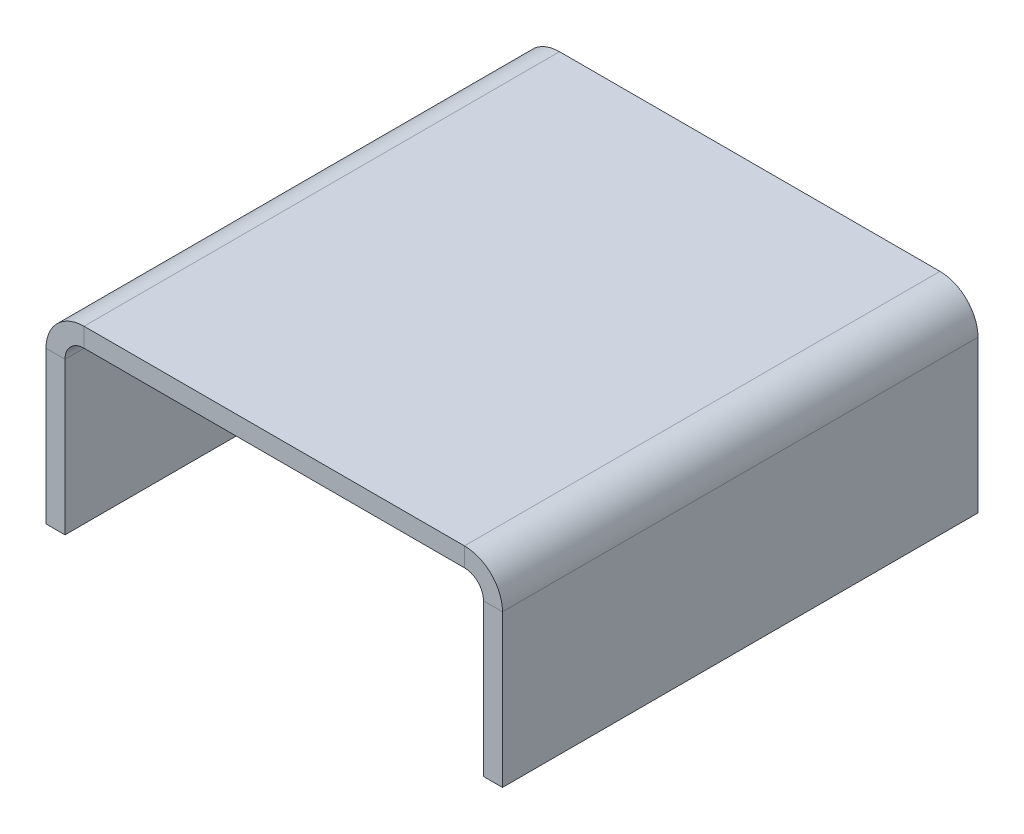
ISO-10303-21;
HEADER;
FILE_DESCRIPTION(('STEP AP214'),'2;1');
FILE_NAME('part.step','',(''),(''),'','','');
FILE_SCHEMA(('AUTOMOTIVE_DESIGN { 1 0 10303 214 1 1 1 1 }'));
ENDSEC;
DATA;
#1=APPLICATION_CONTEXT('core data for automotive mechanical design processes');
#2=APPLICATION_PROTOCOL_DEFINITION('international standard','automotive_design',2000,#1);
#3=PRODUCT_CONTEXT('',#1,'mechanical');
#4=PRODUCT('Part','Part','',(#3));
#5=PRODUCT_RELATED_PRODUCT_CATEGORY('part','',(#4));
#6=PRODUCT_DEFINITION_FORMATION('','',#4);
#7=PRODUCT_DEFINITION_CONTEXT('part definition',#1,'design');
#8=PRODUCT_DEFINITION('design','',#6,#7);
#9=PRODUCT_DEFINITION_SHAPE('','',#8);
#10=(LENGTH_UNIT() NAMED_UNIT(*) SI_UNIT(.MILLI.,.METRE.));
#11=(NAMED_UNIT(*) PLANE_ANGLE_UNIT() SI_UNIT($,.RADIAN.));
#12=(NAMED_UNIT(*) SI_UNIT($,.STERADIAN.) SOLID_ANGLE_UNIT());
#13=UNCERTAINTY_MEASURE_WITH_UNIT(LENGTH_MEASURE(1.E-05),#10,'distance_accuracy_value','');
#14=(GEOMETRIC_REPRESENTATION_CONTEXT(3) GLOBAL_UNCERTAINTY_ASSIGNED_CONTEXT((#13)) GLOBAL_UNIT_ASSIGNED_CONTEXT((#10,
#11,#12)) REPRESENTATION_CONTEXT('',''));
#15=CARTESIAN_POINT('',(0.,0.,0.));
#16=DIRECTION('',(0.,0.,1.));
#17=DIRECTION('',(1.,0.,0.));
#18=AXIS2_PLACEMENT_3D('',#15,#16,#17);
#19=CARTESIAN_POINT('',(0.,16.,-50.));
#20=DIRECTION('',(0.,0.,-1.));
#21=DIRECTION('',(-1.,0.,0.));
#22=AXIS2_PLACEMENT_3D('',#19,#20,#21);
#23=PLANE('',#22);
#24=DIRECTION('',(1.,0.,0.));
#25=VECTOR('',#24,1.);
#26=CARTESIAN_POINT('',(0.,16.,-50.));
#27=LINE('',#26,#25);
#28=CARTESIAN_POINT('',(0.,16.,-50.));
#29=VERTEX_POINT('',#28);
#30=CARTESIAN_POINT('',(2.,16.,-50.));
#31=VERTEX_POINT('',#30);
#32=EDGE_CURVE('E11',#29,#31,#27,.T.);
#33=ORIENTED_EDGE('',*,*,#32,.F.);
#34=CARTESIAN_POINT('',(4.,16.,-50.));
#35=DIRECTION('',(0.,0.,1.));
#36=DIRECTION('',(1.,0.,0.));
#37=AXIS2_PLACEMENT_3D('',#34,#35,#36);
#38=CIRCLE('',#37,4.);
#39=CARTESIAN_POINT('',(4.,20.,-50.));
#40=VERTEX_POINT('',#39);
#41=EDGE_CURVE('E173',#29,#40,#38,.F.);
#42=ORIENTED_EDGE('',*,*,#41,.T.);
#43=DIRECTION('',(0.,1.,0.));
#44=VECTOR('',#43,1.);
#45=CARTESIAN_POINT('',(4.,18.,-50.));
#46=LINE('',#45,#44);
#47=CARTESIAN_POINT('',(4.,18.,-50.));
#48=VERTEX_POINT('',#47);
#49=EDGE_CURVE('E53',#48,#40,#46,.T.);
#50=ORIENTED_EDGE('',*,*,#49,.F.);
#51=CARTESIAN_POINT('',(4.,16.,-50.));
#52=DIRECTION('',(0.,0.,1.));
#53=DIRECTION('',(1.,0.,0.));
#54=AXIS2_PLACEMENT_3D('',#51,#52,#53);
#55=CIRCLE('',#54,2.);
#56=EDGE_CURVE('E170',#31,#48,#55,.F.);
#57=ORIENTED_EDGE('',*,*,#56,.F.);
#58=EDGE_LOOP('',(#33,#42,#50,#57));
#59=FACE_BOUND('',#58,.T.);
#60=ADVANCED_FACE('F44',(#59),#23,.T.);
#61=CARTESIAN_POINT('',(4.,18.,-50.));
#62=DIRECTION('',(0.,0.,-1.));
#63=DIRECTION('',(-1.,0.,0.));
#64=AXIS2_PLACEMENT_3D('',#61,#62,#63);
#65=PLANE('',#64);
#66=DIRECTION('',(0.,1.,0.));
#67=VECTOR('',#66,1.);
#68=CARTESIAN_POINT('',(0.,0.,-50.));
#69=LINE('',#68,#67);
#70=CARTESIAN_POINT('',(0.,0.,-50.));
#71=VERTEX_POINT('',#70);
#72=EDGE_CURVE('E329',#71,#29,#69,.T.);
#73=ORIENTED_EDGE('',*,*,#72,.T.);
#74=ORIENTED_EDGE('',*,*,#32,.T.);
#75=DIRECTION('',(0.,1.,0.));
#76=VECTOR('',#75,1.);
#77=CARTESIAN_POINT('',(2.,0.,-50.));
#78=LINE('',#77,#76);
#79=CARTESIAN_POINT('',(2.,0.,-50.));
#80=VERTEX_POINT('',#79);
#81=EDGE_CURVE('E206',#80,#31,#78,.T.);
#82=ORIENTED_EDGE('',*,*,#81,.F.);
#83=DIRECTION('',(-1.,0.,0.));
#84=VECTOR('',#83,1.);
#85=CARTESIAN_POINT('',(2.,0.,-50.));
#86=LINE('',#85,#84);
#87=EDGE_CURVE('E209',#80,#71,#86,.T.);
#88=ORIENTED_EDGE('',*,*,#87,.T.);
#89=EDGE_LOOP('',(#73,#74,#82,#88));
#90=FACE_BOUND('',#89,.T.);
#91=ADVANCED_FACE('F341',(#90),#65,.T.);
#92=CARTESIAN_POINT('',(4.,20.,0.));
#93=DIRECTION('',(0.,0.,1.));
#94=DIRECTION('',(1.,0.,0.));
#95=AXIS2_PLACEMENT_3D('',#92,#93,#94);
#96=PLANE('',#95);
#97=DIRECTION('',(0.,-1.,0.));
#98=VECTOR('',#97,1.);
#99=CARTESIAN_POINT('',(4.,20.,0.));
#100=LINE('',#99,#98);
#101=CARTESIAN_POINT('',(4.,20.,0.));
#102=VERTEX_POINT('',#101);
#103=CARTESIAN_POINT('',(4.,18.,0.));
#104=VERTEX_POINT('',#103);
#105=EDGE_CURVE('E179',#102,#104,#100,.T.);
#106=ORIENTED_EDGE('',*,*,#105,.F.);
#107=CARTESIAN_POINT('',(4.,16.,0.));
#108=DIRECTION('',(0.,0.,1.));
#109=DIRECTION('',(1.,0.,0.));
#110=AXIS2_PLACEMENT_3D('',#107,#108,#109);
#111=CIRCLE('',#110,4.);
#112=CARTESIAN_POINT('',(0.,16.,0.));
#113=VERTEX_POINT('',#112);
#114=EDGE_CURVE('E235',#113,#102,#111,.F.);
#115=ORIENTED_EDGE('',*,*,#114,.F.);
#116=DIRECTION('',(-1.,0.,0.));
#117=VECTOR('',#116,1.);
#118=CARTESIAN_POINT('',(2.,16.,0.));
#119=LINE('',#118,#117);
#120=CARTESIAN_POINT('',(2.,16.,0.));
#121=VERTEX_POINT('',#120);
#122=EDGE_CURVE('E303',#121,#113,#119,.T.);
#123=ORIENTED_EDGE('',*,*,#122,.F.);
#124=CARTESIAN_POINT('',(4.,16.,0.));
#125=DIRECTION('',(0.,0.,1.));
#126=DIRECTION('',(1.,0.,0.));
#127=AXIS2_PLACEMENT_3D('',#124,#125,#126);
#128=CIRCLE('',#127,2.);
#129=EDGE_CURVE('E250',#121,#104,#128,.F.);
#130=ORIENTED_EDGE('',*,*,#129,.T.);
#131=EDGE_LOOP('',(#106,#115,#123,#130));
#132=FACE_BOUND('',#131,.T.);
#133=ADVANCED_FACE('F313',(#132),#96,.T.);
#134=CARTESIAN_POINT('',(2.,16.,0.));
#135=DIRECTION('',(0.,0.,1.));
#136=DIRECTION('',(1.,0.,0.));
#137=AXIS2_PLACEMENT_3D('',#134,#135,#136);
#138=PLANE('',#137);
#139=DIRECTION('',(1.,0.,0.));
#140=VECTOR('',#139,1.);
#141=CARTESIAN_POINT('',(0.,20.,0.));
#142=LINE('',#141,#140);
#143=CARTESIAN_POINT('',(44.,20.,0.));
#144=VERTEX_POINT('',#143);
#145=EDGE_CURVE('E231',#102,#144,#142,.T.);
#146=ORIENTED_EDGE('',*,*,#145,.F.);
#147=ORIENTED_EDGE('',*,*,#105,.T.);
#148=DIRECTION('',(1.,0.,0.));
#149=VECTOR('',#148,1.);
#150=CARTESIAN_POINT('',(0.,18.,0.));
#151=LINE('',#150,#149);
#152=CARTESIAN_POINT('',(44.,18.,0.));
#153=VERTEX_POINT('',#152);
#154=EDGE_CURVE('E188',#104,#153,#151,.T.);
#155=ORIENTED_EDGE('',*,*,#154,.T.);
#156=DIRECTION('',(0.,1.,0.));
#157=VECTOR('',#156,1.);
#158=CARTESIAN_POINT('',(44.,18.,0.));
#159=LINE('',#158,#157);
#160=EDGE_CURVE('E117',#153,#144,#159,.T.);
#161=ORIENTED_EDGE('',*,*,#160,.T.);
#162=EDGE_LOOP('',(#146,#147,#155,#161));
#163=FACE_BOUND('',#162,.T.);
#164=ADVANCED_FACE('F309',(#163),#138,.T.);
#165=CARTESIAN_POINT('',(44.,20.,-50.));
#166=DIRECTION('',(0.,0.,-1.));
#167=DIRECTION('',(-1.,0.,0.));
#168=AXIS2_PLACEMENT_3D('',#165,#166,#167);
#169=PLANE('',#168);
#170=DIRECTION('',(0.,-1.,0.));
#171=VECTOR('',#170,1.);
#172=CARTESIAN_POINT('',(44.,20.,-50.));
#173=LINE('',#172,#171);
#174=CARTESIAN_POINT('',(44.,20.,-50.));
#175=VERTEX_POINT('',#174);
#176=CARTESIAN_POINT('',(44.,18.,-50.));
#177=VERTEX_POINT('',#176);
#178=EDGE_CURVE('E197',#175,#177,#173,.T.);
#179=ORIENTED_EDGE('',*,*,#178,.F.);
#180=CARTESIAN_POINT('',(44.,16.,-50.));
#181=DIRECTION('',(0.,0.,1.));
#182=DIRECTION('',(1.,0.,0.));
#183=AXIS2_PLACEMENT_3D('',#180,#181,#182);
#184=CIRCLE('',#183,4.);
#185=CARTESIAN_POINT('',(48.,16.,-50.));
#186=VERTEX_POINT('',#185);
#187=EDGE_CURVE('E324',#175,#186,#184,.F.);
#188=ORIENTED_EDGE('',*,*,#187,.T.);
#189=DIRECTION('',(1.,0.,0.));
#190=VECTOR('',#189,1.);
#191=CARTESIAN_POINT('',(46.,16.,-50.));
#192=LINE('',#191,#190);
#193=CARTESIAN_POINT('',(46.,16.,-50.));
#194=VERTEX_POINT('',#193);
#195=EDGE_CURVE('E64',#194,#186,#192,.T.);
#196=ORIENTED_EDGE('',*,*,#195,.F.);
#197=CARTESIAN_POINT('',(44.,16.,-50.));
#198=DIRECTION('',(0.,0.,1.));
#199=DIRECTION('',(1.,0.,0.));
#200=AXIS2_PLACEMENT_3D('',#197,#198,#199);
#201=CIRCLE('',#200,2.);
#202=EDGE_CURVE('E200',#177,#194,#201,.F.);
#203=ORIENTED_EDGE('',*,*,#202,.F.);
#204=EDGE_LOOP('',(#179,#188,#196,#203));
#205=FACE_BOUND('',#204,.T.);
#206=ADVANCED_FACE('F373',(#205),#169,.T.);
#207=CARTESIAN_POINT('',(46.,16.,-50.));
#208=DIRECTION('',(0.,0.,-1.));
#209=DIRECTION('',(-1.,0.,0.));
#210=AXIS2_PLACEMENT_3D('',#207,#208,#209);
#211=PLANE('',#210);
#212=DIRECTION('',(1.,0.,0.));
#213=VECTOR('',#212,1.);
#214=CARTESIAN_POINT('',(0.,20.,-50.));
#215=LINE('',#214,#213);
#216=EDGE_CURVE('E321',#40,#175,#215,.T.);
#217=ORIENTED_EDGE('',*,*,#216,.T.);
#218=ORIENTED_EDGE('',*,*,#178,.T.);
#219=DIRECTION('',(1.,0.,0.));
#220=VECTOR('',#219,1.);
#221=CARTESIAN_POINT('',(0.,18.,-50.));
#222=LINE('',#221,#220);
#223=EDGE_CURVE('E186',#48,#177,#222,.T.);
#224=ORIENTED_EDGE('',*,*,#223,.F.);
#225=ORIENTED_EDGE('',*,*,#49,.T.);
#226=EDGE_LOOP('',(#217,#218,#224,#225));
#227=FACE_BOUND('',#226,.T.);
#228=ADVANCED_FACE('F196',(#227),#211,.T.);
#229=CARTESIAN_POINT('',(48.,16.,0.));
#230=DIRECTION('',(0.,0.,1.));
#231=DIRECTION('',(1.,0.,0.));
#232=AXIS2_PLACEMENT_3D('',#229,#230,#231);
#233=PLANE('',#232);
#234=DIRECTION('',(-1.,0.,0.));
#235=VECTOR('',#234,1.);
#236=CARTESIAN_POINT('',(48.,16.,0.));
#237=LINE('',#236,#235);
#238=CARTESIAN_POINT('',(48.,16.,0.));
#239=VERTEX_POINT('',#238);
#240=CARTESIAN_POINT('',(46.,16.,0.));
#241=VERTEX_POINT('',#240);
#242=EDGE_CURVE('E124',#239,#241,#237,.T.);
#243=ORIENTED_EDGE('',*,*,#242,.F.);
#244=CARTESIAN_POINT('',(44.,16.,0.));
#245=DIRECTION('',(0.,0.,1.));
#246=DIRECTION('',(1.,0.,0.));
#247=AXIS2_PLACEMENT_3D('',#244,#245,#246);
#248=CIRCLE('',#247,4.);
#249=EDGE_CURVE('E227',#144,#239,#248,.F.);
#250=ORIENTED_EDGE('',*,*,#249,.F.);
#251=ORIENTED_EDGE('',*,*,#160,.F.);
#252=CARTESIAN_POINT('',(44.,16.,0.));
#253=DIRECTION('',(0.,0.,1.));
#254=DIRECTION('',(1.,0.,0.));
#255=AXIS2_PLACEMENT_3D('',#252,#253,#254);
#256=CIRCLE('',#255,2.);
#257=EDGE_CURVE('E255',#153,#241,#256,.F.);
#258=ORIENTED_EDGE('',*,*,#257,.T.);
#259=EDGE_LOOP('',(#243,#250,#251,#258));
#260=FACE_BOUND('',#259,.T.);
#261=ADVANCED_FACE('F378',(#260),#233,.T.);
#262=CARTESIAN_POINT('',(44.,18.,0.));
#263=DIRECTION('',(0.,0.,1.));
#264=DIRECTION('',(1.,0.,0.));
#265=AXIS2_PLACEMENT_3D('',#262,#263,#264);
#266=PLANE('',#265);
#267=DIRECTION('',(0.,-1.,0.));
#268=VECTOR('',#267,1.);
#269=CARTESIAN_POINT('',(48.,20.,0.));
#270=LINE('',#269,#268);
#271=CARTESIAN_POINT('',(48.,0.,0.));
#272=VERTEX_POINT('',#271);
#273=EDGE_CURVE('E224',#239,#272,#270,.T.);
#274=ORIENTED_EDGE('',*,*,#273,.F.);
#275=ORIENTED_EDGE('',*,*,#242,.T.);
#276=DIRECTION('',(0.,1.,0.));
#277=VECTOR('',#276,1.);
#278=CARTESIAN_POINT('',(46.,20.,0.));
#279=LINE('',#278,#277);
#280=CARTESIAN_POINT('',(46.,0.,0.));
#281=VERTEX_POINT('',#280);
#282=EDGE_CURVE('E217',#241,#281,#279,.F.);
#283=ORIENTED_EDGE('',*,*,#282,.T.);
#284=DIRECTION('',(-1.,0.,0.));
#285=VECTOR('',#284,1.);
#286=CARTESIAN_POINT('',(48.,0.,0.));
#287=LINE('',#286,#285);
#288=EDGE_CURVE('E220',#272,#281,#287,.T.);
#289=ORIENTED_EDGE('',*,*,#288,.F.);
#290=EDGE_LOOP('',(#274,#275,#283,#289));
#291=FACE_BOUND('',#290,.T.);
#292=ADVANCED_FACE('F381',(#291),#266,.T.);
#293=CARTESIAN_POINT('',(46.,20.,-50.));
#294=DIRECTION('',(-1.,0.,0.));
#295=DIRECTION('',(0.,0.,1.));
#296=AXIS2_PLACEMENT_3D('',#293,#294,#295);
#297=PLANE('',#296);
#298=ORIENTED_EDGE('',*,*,#282,.F.);
#299=DIRECTION('',(0.,0.,1.));
#300=VECTOR('',#299,1.);
#301=CARTESIAN_POINT('',(46.,16.,-50.));
#302=LINE('',#301,#300);
#303=EDGE_CURVE('E259',#194,#241,#302,.T.);
#304=ORIENTED_EDGE('',*,*,#303,.F.);
#305=DIRECTION('',(0.,1.,0.));
#306=VECTOR('',#305,1.);
#307=CARTESIAN_POINT('',(46.,20.,-50.));
#308=LINE('',#307,#306);
#309=CARTESIAN_POINT('',(46.,0.,-50.));
#310=VERTEX_POINT('',#309);
#311=EDGE_CURVE('E258',#194,#310,#308,.F.);
#312=ORIENTED_EDGE('',*,*,#311,.T.);
#313=DIRECTION('',(0.,0.,1.));
#314=VECTOR('',#313,1.);
#315=CARTESIAN_POINT('',(46.,0.,-50.));
#316=LINE('',#315,#314);
#317=EDGE_CURVE('E216',#310,#281,#316,.T.);
#318=ORIENTED_EDGE('',*,*,#317,.T.);
#319=EDGE_LOOP('',(#298,#304,#312,#318));
#320=FACE_BOUND('',#319,.T.);
#321=ADVANCED_FACE('F384',(#320),#297,.T.);
#322=CARTESIAN_POINT('',(44.,16.,-50.));
#323=DIRECTION('',(0.,0.,1.));
#324=DIRECTION('',(1.,0.,0.));
#325=AXIS2_PLACEMENT_3D('',#322,#323,#324);
#326=CYLINDRICAL_SURFACE('',#325,2.);
#327=ORIENTED_EDGE('',*,*,#257,.F.);
#328=DIRECTION('',(0.,0.,1.));
#329=VECTOR('',#328,1.);
#330=CARTESIAN_POINT('',(44.,18.,-50.));
#331=LINE('',#330,#329);
#332=EDGE_CURVE('E193',#177,#153,#331,.T.);
#333=ORIENTED_EDGE('',*,*,#332,.F.);
#334=ORIENTED_EDGE('',*,*,#202,.T.);
#335=ORIENTED_EDGE('',*,*,#303,.T.);
#336=EDGE_LOOP('',(#327,#333,#334,#335));
#337=FACE_BOUND('',#336,.T.);
#338=ADVANCED_FACE('F387',(#337),#326,.F.);
#339=CARTESIAN_POINT('',(0.,18.,-50.));
#340=DIRECTION('',(0.,-1.,0.));
#341=DIRECTION('',(0.,0.,-1.));
#342=AXIS2_PLACEMENT_3D('',#339,#340,#341);
#343=PLANE('',#342);
#344=ORIENTED_EDGE('',*,*,#154,.F.);
#345=DIRECTION('',(0.,0.,1.));
#346=VECTOR('',#345,1.);
#347=CARTESIAN_POINT('',(4.,18.,-50.));
#348=LINE('',#347,#346);
#349=EDGE_CURVE('E184',#48,#104,#348,.T.);
#350=ORIENTED_EDGE('',*,*,#349,.F.);
#351=ORIENTED_EDGE('',*,*,#223,.T.);
#352=ORIENTED_EDGE('',*,*,#332,.T.);
#353=EDGE_LOOP('',(#344,#350,#351,#352));
#354=FACE_BOUND('',#353,.T.);
#355=ADVANCED_FACE('F185',(#354),#343,.T.);
#356=CARTESIAN_POINT('',(4.,16.,-50.));
#357=DIRECTION('',(0.,0.,1.));
#358=DIRECTION('',(1.,0.,0.));
#359=AXIS2_PLACEMENT_3D('',#356,#357,#358);
#360=CYLINDRICAL_SURFACE('',#359,2.);
#361=ORIENTED_EDGE('',*,*,#129,.F.);
#362=DIRECTION('',(0.,0.,1.));
#363=VECTOR('',#362,1.);
#364=CARTESIAN_POINT('',(2.,16.,-50.));
#365=LINE('',#364,#363);
#366=EDGE_CURVE('E194',#31,#121,#365,.T.);
#367=ORIENTED_EDGE('',*,*,#366,.F.);
#368=ORIENTED_EDGE('',*,*,#56,.T.);
#369=ORIENTED_EDGE('',*,*,#349,.T.);
#370=EDGE_LOOP('',(#361,#367,#368,#369));
#371=FACE_BOUND('',#370,.T.);
#372=ADVANCED_FACE('F203',(#371),#360,.F.);
#373=CARTESIAN_POINT('',(2.,0.,-50.));
#374=DIRECTION('',(1.,0.,0.));
#375=DIRECTION('',(0.,0.,-1.));
#376=AXIS2_PLACEMENT_3D('',#373,#374,#375);
#377=PLANE('',#376);
#378=DIRECTION('',(0.,1.,0.));
#379=VECTOR('',#378,1.);
#380=CARTESIAN_POINT('',(2.,0.,0.));
#381=LINE('',#380,#379);
#382=CARTESIAN_POINT('',(2.,0.,0.));
#383=VERTEX_POINT('',#382);
#384=EDGE_CURVE('E246',#383,#121,#381,.T.);
#385=ORIENTED_EDGE('',*,*,#384,.F.);
#386=DIRECTION('',(0.,0.,1.));
#387=VECTOR('',#386,1.);
#388=CARTESIAN_POINT('',(2.,0.,-50.));
#389=LINE('',#388,#387);
#390=EDGE_CURVE('E266',#80,#383,#389,.T.);
#391=ORIENTED_EDGE('',*,*,#390,.F.);
#392=ORIENTED_EDGE('',*,*,#81,.T.);
#393=ORIENTED_EDGE('',*,*,#366,.T.);
#394=EDGE_LOOP('',(#385,#391,#392,#393));
#395=FACE_BOUND('',#394,.T.);
#396=ADVANCED_FACE('F353',(#395),#377,.T.);
#397=CARTESIAN_POINT('',(2.,0.,-50.));
#398=DIRECTION('',(0.,1.,0.));
#399=DIRECTION('',(0.,0.,1.));
#400=AXIS2_PLACEMENT_3D('',#397,#398,#399);
#401=PLANE('',#400);
#402=DIRECTION('',(-1.,0.,0.));
#403=VECTOR('',#402,1.);
#404=CARTESIAN_POINT('',(2.,0.,0.));
#405=LINE('',#404,#403);
#406=CARTESIAN_POINT('',(0.,0.,0.));
#407=VERTEX_POINT('',#406);
#408=EDGE_CURVE('E243',#383,#407,#405,.T.);
#409=ORIENTED_EDGE('',*,*,#408,.T.);
#410=DIRECTION('',(0.,0.,1.));
#411=VECTOR('',#410,1.);
#412=CARTESIAN_POINT('',(0.,0.,-50.));
#413=LINE('',#412,#411);
#414=EDGE_CURVE('E269',#71,#407,#413,.T.);
#415=ORIENTED_EDGE('',*,*,#414,.F.);
#416=ORIENTED_EDGE('',*,*,#87,.F.);
#417=ORIENTED_EDGE('',*,*,#390,.T.);
#418=EDGE_LOOP('',(#409,#415,#416,#417));
#419=FACE_BOUND('',#418,.T.);
#420=ADVANCED_FACE('F344',(#419),#401,.F.);
#421=CARTESIAN_POINT('',(0.,0.,-50.));
#422=DIRECTION('',(1.,0.,0.));
#423=DIRECTION('',(0.,0.,-1.));
#424=AXIS2_PLACEMENT_3D('',#421,#422,#423);
#425=PLANE('',#424);
#426=DIRECTION('',(0.,1.,0.));
#427=VECTOR('',#426,1.);
#428=CARTESIAN_POINT('',(0.,0.,0.));
#429=LINE('',#428,#427);
#430=EDGE_CURVE('E239',#407,#113,#429,.T.);
#431=ORIENTED_EDGE('',*,*,#430,.T.);
#432=DIRECTION('',(0.,0.,1.));
#433=VECTOR('',#432,1.);
#434=CARTESIAN_POINT('',(0.,16.,-50.));
#435=LINE('',#434,#433);
#436=EDGE_CURVE('E273',#29,#113,#435,.T.);
#437=ORIENTED_EDGE('',*,*,#436,.F.);
#438=ORIENTED_EDGE('',*,*,#72,.F.);
#439=ORIENTED_EDGE('',*,*,#414,.T.);
#440=EDGE_LOOP('',(#431,#437,#438,#439));
#441=FACE_BOUND('',#440,.T.);
#442=ADVANCED_FACE('F348',(#441),#425,.F.);
#443=CARTESIAN_POINT('',(4.,16.,-50.));
#444=DIRECTION('',(0.,0.,1.));
#445=DIRECTION('',(1.,0.,0.));
#446=AXIS2_PLACEMENT_3D('',#443,#444,#445);
#447=CYLINDRICAL_SURFACE('',#446,4.);
#448=ORIENTED_EDGE('',*,*,#114,.T.);
#449=DIRECTION('',(0.,0.,1.));
#450=VECTOR('',#449,1.);
#451=CARTESIAN_POINT('',(4.,20.,-50.));
#452=LINE('',#451,#450);
#453=EDGE_CURVE('E277',#40,#102,#452,.T.);
#454=ORIENTED_EDGE('',*,*,#453,.F.);
#455=ORIENTED_EDGE('',*,*,#41,.F.);
#456=ORIENTED_EDGE('',*,*,#436,.T.);
#457=EDGE_LOOP('',(#448,#454,#455,#456));
#458=FACE_BOUND('',#457,.T.);
#459=ADVANCED_FACE('F315',(#458),#447,.T.);
#460=CARTESIAN_POINT('',(0.,20.,-50.));
#461=DIRECTION('',(0.,-1.,0.));
#462=DIRECTION('',(0.,0.,-1.));
#463=AXIS2_PLACEMENT_3D('',#460,#461,#462);
#464=PLANE('',#463);
#465=ORIENTED_EDGE('',*,*,#145,.T.);
#466=DIRECTION('',(0.,0.,1.));
#467=VECTOR('',#466,1.);
#468=CARTESIAN_POINT('',(44.,20.,-50.));
#469=LINE('',#468,#467);
#470=EDGE_CURVE('E281',#175,#144,#469,.T.);
#471=ORIENTED_EDGE('',*,*,#470,.F.);
#472=ORIENTED_EDGE('',*,*,#216,.F.);
#473=ORIENTED_EDGE('',*,*,#453,.T.);
#474=EDGE_LOOP('',(#465,#471,#472,#473));
#475=FACE_BOUND('',#474,.T.);
#476=ADVANCED_FACE('F319',(#475),#464,.F.);
#477=CARTESIAN_POINT('',(44.,16.,-50.));
#478=DIRECTION('',(0.,0.,1.));
#479=DIRECTION('',(1.,0.,0.));
#480=AXIS2_PLACEMENT_3D('',#477,#478,#479);
#481=CYLINDRICAL_SURFACE('',#480,4.);
#482=ORIENTED_EDGE('',*,*,#249,.T.);
#483=DIRECTION('',(0.,0.,1.));
#484=VECTOR('',#483,1.);
#485=CARTESIAN_POINT('',(48.,16.,-50.));
#486=LINE('',#485,#484);
#487=EDGE_CURVE('E285',#186,#239,#486,.T.);
#488=ORIENTED_EDGE('',*,*,#487,.F.);
#489=ORIENTED_EDGE('',*,*,#187,.F.);
#490=ORIENTED_EDGE('',*,*,#470,.T.);
#491=EDGE_LOOP('',(#482,#488,#489,#490));
#492=FACE_BOUND('',#491,.T.);
#493=ADVANCED_FACE('F397',(#492),#481,.T.);
#494=CARTESIAN_POINT('',(48.,20.,-50.));
#495=DIRECTION('',(-1.,0.,0.));
#496=DIRECTION('',(0.,0.,1.));
#497=AXIS2_PLACEMENT_3D('',#494,#495,#496);
#498=PLANE('',#497);
#499=ORIENTED_EDGE('',*,*,#273,.T.);
#500=DIRECTION('',(0.,0.,1.));
#501=VECTOR('',#500,1.);
#502=CARTESIAN_POINT('',(48.,0.,-50.));
#503=LINE('',#502,#501);
#504=CARTESIAN_POINT('',(48.,0.,-50.));
#505=VERTEX_POINT('',#504);
#506=EDGE_CURVE('E289',#505,#272,#503,.T.);
#507=ORIENTED_EDGE('',*,*,#506,.F.);
#508=DIRECTION('',(0.,-1.,0.));
#509=VECTOR('',#508,1.);
#510=CARTESIAN_POINT('',(48.,20.,-50.));
#511=LINE('',#510,#509);
#512=EDGE_CURVE('E331',#186,#505,#511,.T.);
#513=ORIENTED_EDGE('',*,*,#512,.F.);
#514=ORIENTED_EDGE('',*,*,#487,.T.);
#515=EDGE_LOOP('',(#499,#507,#513,#514));
#516=FACE_BOUND('',#515,.T.);
#517=ADVANCED_FACE('F393',(#516),#498,.F.);
#518=CARTESIAN_POINT('',(48.,0.,-50.));
#519=DIRECTION('',(0.,1.,0.));
#520=DIRECTION('',(0.,0.,1.));
#521=AXIS2_PLACEMENT_3D('',#518,#519,#520);
#522=PLANE('',#521);
#523=ORIENTED_EDGE('',*,*,#288,.T.);
#524=ORIENTED_EDGE('',*,*,#317,.F.);
#525=DIRECTION('',(-1.,0.,0.));
#526=VECTOR('',#525,1.);
#527=CARTESIAN_POINT('',(48.,0.,-50.));
#528=LINE('',#527,#526);
#529=EDGE_CURVE('E135',#505,#310,#528,.T.);
#530=ORIENTED_EDGE('',*,*,#529,.F.);
#531=ORIENTED_EDGE('',*,*,#506,.T.);
#532=EDGE_LOOP('',(#523,#524,#530,#531));
#533=FACE_BOUND('',#532,.T.);
#534=ADVANCED_FACE('F389',(#533),#522,.F.);
#535=CARTESIAN_POINT('',(44.,16.,-50.));
#536=DIRECTION('',(0.,0.,1.));
#537=DIRECTION('',(1.,0.,0.));
#538=AXIS2_PLACEMENT_3D('',#535,#536,#537);
#539=PLANE('',#538);
#540=ORIENTED_EDGE('',*,*,#311,.F.);
#541=ORIENTED_EDGE('',*,*,#195,.T.);
#542=ORIENTED_EDGE('',*,*,#512,.T.);
#543=ORIENTED_EDGE('',*,*,#529,.T.);
#544=EDGE_LOOP('',(#540,#541,#542,#543));
#545=FACE_BOUND('',#544,.T.);
#546=ADVANCED_FACE('F392',(#545),#539,.F.);
#547=CARTESIAN_POINT('',(44.,16.,0.));
#548=DIRECTION('',(0.,0.,1.));
#549=DIRECTION('',(1.,0.,0.));
#550=AXIS2_PLACEMENT_3D('',#547,#548,#549);
#551=PLANE('',#550);
#552=ORIENTED_EDGE('',*,*,#384,.T.);
#553=ORIENTED_EDGE('',*,*,#122,.T.);
#554=ORIENTED_EDGE('',*,*,#430,.F.);
#555=ORIENTED_EDGE('',*,*,#408,.F.);
#556=EDGE_LOOP('',(#552,#553,#554,#555));
#557=FACE_BOUND('',#556,.T.);
#558=ADVANCED_FACE('F350',(#557),#551,.T.);
#559=CLOSED_SHELL('',(#60,#91,#133,#164,#206,#228,#261,#292,#321,#338,#355,#372,#396,#420,#442,
#459,#476,#493,#517,#534,#546,#558));
#560=MANIFOLD_SOLID_BREP('B2',#559);
#561=ADVANCED_BREP_SHAPE_REPRESENTATION('',(#18,#560),#14);
#562=SHAPE_DEFINITION_REPRESENTATION(#9,#561);
ENDSEC;
END-ISO-10303-21;
